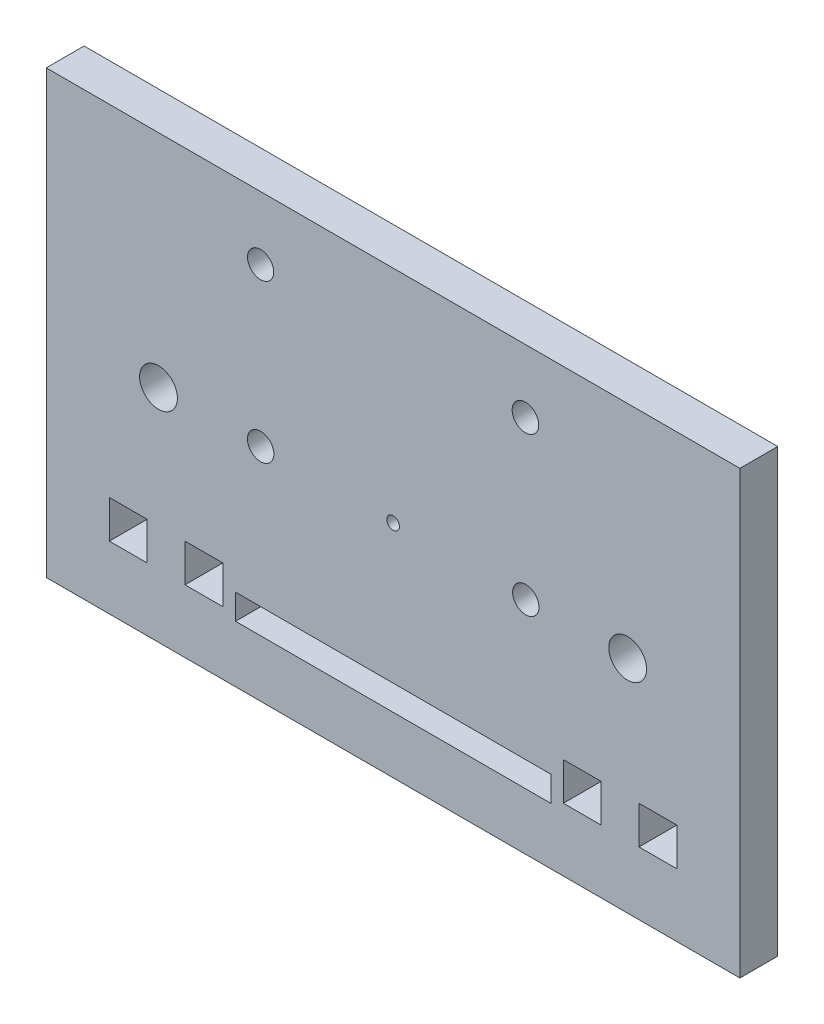
ISO-10303-21;
HEADER;
FILE_DESCRIPTION(('STEP AP214'),'2;1');
FILE_NAME('part.step','',(''),(''),'','','');
FILE_SCHEMA(('AUTOMOTIVE_DESIGN { 1 0 10303 214 1 1 1 1 }'));
ENDSEC;
DATA;
#1=APPLICATION_CONTEXT('core data for automotive mechanical design processes');
#2=APPLICATION_PROTOCOL_DEFINITION('international standard','automotive_design',2000,#1);
#3=PRODUCT_CONTEXT('',#1,'mechanical');
#4=PRODUCT('Part','Part','',(#3));
#5=PRODUCT_RELATED_PRODUCT_CATEGORY('part','',(#4));
#6=PRODUCT_DEFINITION_FORMATION('','',#4);
#7=PRODUCT_DEFINITION_CONTEXT('part definition',#1,'design');
#8=PRODUCT_DEFINITION('design','',#6,#7);
#9=PRODUCT_DEFINITION_SHAPE('','',#8);
#10=(LENGTH_UNIT() NAMED_UNIT(*) SI_UNIT(.MILLI.,.METRE.));
#11=(NAMED_UNIT(*) PLANE_ANGLE_UNIT() SI_UNIT($,.RADIAN.));
#12=(NAMED_UNIT(*) SI_UNIT($,.STERADIAN.) SOLID_ANGLE_UNIT());
#13=UNCERTAINTY_MEASURE_WITH_UNIT(LENGTH_MEASURE(1.E-05),#10,'distance_accuracy_value','');
#14=(GEOMETRIC_REPRESENTATION_CONTEXT(3) GLOBAL_UNCERTAINTY_ASSIGNED_CONTEXT((#13)) GLOBAL_UNIT_ASSIGNED_CONTEXT((#10,
#11,#12)) REPRESENTATION_CONTEXT('',''));
#15=CARTESIAN_POINT('',(0.,0.,0.));
#16=DIRECTION('',(0.,0.,1.));
#17=DIRECTION('',(1.,0.,0.));
#18=AXIS2_PLACEMENT_3D('',#15,#16,#17);
#19=CARTESIAN_POINT('',(0.,0.,3.));
#20=DIRECTION('',(0.,0.,-1.));
#21=DIRECTION('',(-1.,0.,0.));
#22=AXIS2_PLACEMENT_3D('',#19,#20,#21);
#23=PLANE('',#22);
#24=CARTESIAN_POINT('',(-10.5042104524228,12.4859981779281,3.));
#25=DIRECTION('',(0.,0.,1.));
#26=DIRECTION('',(1.,0.,0.));
#27=AXIS2_PLACEMENT_3D('',#24,#25,#26);
#28=CIRCLE('',#27,1.03797105295401);
#29=CARTESIAN_POINT('',(-9.46623939946874,12.4859981779281,3.));
#30=VERTEX_POINT('',#29);
#31=EDGE_CURVE('E795',#30,#30,#28,.T.);
#32=ORIENTED_EDGE('',*,*,#31,.F.);
#33=EDGE_LOOP('',(#32));
#34=FACE_BOUND('',#33,.T.);
#35=CARTESIAN_POINT('',(10.4942170004527,12.4883752274117,3.));
#36=DIRECTION('',(0.,0.,1.));
#37=DIRECTION('',(1.,0.,0.));
#38=AXIS2_PLACEMENT_3D('',#35,#36,#37);
#39=CIRCLE('',#38,1.0524891929786);
#40=CARTESIAN_POINT('',(11.5467061934313,12.4883752274117,3.));
#41=VERTEX_POINT('',#40);
#42=EDGE_CURVE('E800',#41,#41,#39,.T.);
#43=ORIENTED_EDGE('',*,*,#42,.F.);
#44=EDGE_LOOP('',(#43));
#45=FACE_BOUND('',#44,.T.);
#46=CARTESIAN_POINT('',(-10.5023216477709,-0.00263104180474381,3.));
#47=DIRECTION('',(0.,0.,1.));
#48=DIRECTION('',(1.,0.,0.));
#49=AXIS2_PLACEMENT_3D('',#46,#47,#48);
#50=CIRCLE('',#49,1.04781735771425);
#51=CARTESIAN_POINT('',(-9.45450429005665,-0.00263104180474381,3.));
#52=VERTEX_POINT('',#51);
#53=EDGE_CURVE('E807',#52,#52,#50,.T.);
#54=ORIENTED_EDGE('',*,*,#53,.F.);
#55=EDGE_LOOP('',(#54));
#56=FACE_BOUND('',#55,.T.);
#57=CARTESIAN_POINT('',(10.5239846187159,-0.00929074852966256,3.));
#58=DIRECTION('',(0.,0.,1.));
#59=DIRECTION('',(1.,0.,0.));
#60=AXIS2_PLACEMENT_3D('',#57,#58,#59);
#61=CIRCLE('',#60,1.04480594836211);
#62=CARTESIAN_POINT('',(11.568790567078,-0.00929074852966256,3.));
#63=VERTEX_POINT('',#62);
#64=EDGE_CURVE('E220',#63,#63,#61,.T.);
#65=ORIENTED_EDGE('',*,*,#64,.F.);
#66=EDGE_LOOP('',(#65));
#67=FACE_BOUND('',#66,.T.);
#68=DIRECTION('',(0.,-1.,0.));
#69=VECTOR('',#68,1.);
#70=CARTESIAN_POINT('',(-13.5,0.,3.));
#71=LINE('',#70,#69);
#72=CARTESIAN_POINT('',(-13.5,-9.5,3.));
#73=VERTEX_POINT('',#72);
#74=CARTESIAN_POINT('',(-13.5,-12.5,3.));
#75=VERTEX_POINT('',#74);
#76=EDGE_CURVE('E56',#73,#75,#71,.T.);
#77=ORIENTED_EDGE('',*,*,#76,.T.);
#78=DIRECTION('',(1.,0.,0.));
#79=VECTOR('',#78,1.);
#80=CARTESIAN_POINT('',(0.,-12.5,3.));
#81=LINE('',#80,#79);
#82=CARTESIAN_POINT('',(-16.5,-12.5,3.));
#83=VERTEX_POINT('',#82);
#84=EDGE_CURVE('E240',#83,#75,#81,.T.);
#85=ORIENTED_EDGE('',*,*,#84,.F.);
#86=DIRECTION('',(0.,-1.,0.));
#87=VECTOR('',#86,1.);
#88=CARTESIAN_POINT('',(-16.5,0.,3.));
#89=LINE('',#88,#87);
#90=CARTESIAN_POINT('',(-16.5,-9.5,3.));
#91=VERTEX_POINT('',#90);
#92=EDGE_CURVE('E254',#91,#83,#89,.T.);
#93=ORIENTED_EDGE('',*,*,#92,.F.);
#94=DIRECTION('',(1.,0.,0.));
#95=VECTOR('',#94,1.);
#96=CARTESIAN_POINT('',(0.,-9.5,3.));
#97=LINE('',#96,#95);
#98=EDGE_CURVE('E250',#91,#73,#97,.T.);
#99=ORIENTED_EDGE('',*,*,#98,.T.);
#100=EDGE_LOOP('',(#77,#85,#93,#99));
#101=FACE_BOUND('',#100,.T.);
#102=DIRECTION('',(0.,-1.,0.));
#103=VECTOR('',#102,1.);
#104=CARTESIAN_POINT('',(22.4999999999998,3.64291929955126E-13,3.));
#105=LINE('',#104,#103);
#106=CARTESIAN_POINT('',(22.4999999999999,-9.49999999999963,3.));
#107=VERTEX_POINT('',#106);
#108=CARTESIAN_POINT('',(22.5,-12.4999999999996,3.));
#109=VERTEX_POINT('',#108);
#110=EDGE_CURVE('E309',#107,#109,#105,.T.);
#111=ORIENTED_EDGE('',*,*,#110,.T.);
#112=DIRECTION('',(-1.,0.,0.));
#113=VECTOR('',#112,1.);
#114=CARTESIAN_POINT('',(2.02384405530628E-13,-12.5,3.));
#115=LINE('',#114,#113);
#116=CARTESIAN_POINT('',(19.5,-12.4999999999997,3.));
#117=VERTEX_POINT('',#116);
#118=EDGE_CURVE('E300',#109,#117,#115,.T.);
#119=ORIENTED_EDGE('',*,*,#118,.T.);
#120=DIRECTION('',(0.,-1.,0.));
#121=VECTOR('',#120,1.);
#122=CARTESIAN_POINT('',(19.4999999999998,3.15719672627776E-13,3.));
#123=LINE('',#122,#121);
#124=CARTESIAN_POINT('',(19.4999999999999,-9.49999999999968,3.));
#125=VERTEX_POINT('',#124);
#126=EDGE_CURVE('E316',#125,#117,#123,.T.);
#127=ORIENTED_EDGE('',*,*,#126,.F.);
#128=DIRECTION('',(-1.,0.,0.));
#129=VECTOR('',#128,1.);
#130=CARTESIAN_POINT('',(1.48318857196017E-13,-9.49999999999998,3.));
#131=LINE('',#130,#129);
#132=EDGE_CURVE('E312',#107,#125,#131,.T.);
#133=ORIENTED_EDGE('',*,*,#132,.F.);
#134=EDGE_LOOP('',(#111,#119,#127,#133));
#135=FACE_BOUND('',#134,.T.);
#136=DIRECTION('',(1.,0.,0.));
#137=VECTOR('',#136,1.);
#138=CARTESIAN_POINT('',(-12.4915760724029,-13.,3.));
#139=LINE('',#138,#137);
#140=CARTESIAN_POINT('',(-12.4915760724029,-13.,3.));
#141=VERTEX_POINT('',#140);
#142=CARTESIAN_POINT('',(12.5084239275971,-13.,3.));
#143=VERTEX_POINT('',#142);
#144=EDGE_CURVE('E330',#141,#143,#139,.T.);
#145=ORIENTED_EDGE('',*,*,#144,.F.);
#146=DIRECTION('',(0.,-1.,0.));
#147=VECTOR('',#146,1.);
#148=CARTESIAN_POINT('',(-12.4915760724029,-11.,3.));
#149=LINE('',#148,#147);
#150=CARTESIAN_POINT('',(-12.4915760724029,-11.,3.));
#151=VERTEX_POINT('',#150);
#152=EDGE_CURVE('E233',#151,#141,#149,.T.);
#153=ORIENTED_EDGE('',*,*,#152,.F.);
#154=DIRECTION('',(-1.,0.,0.));
#155=VECTOR('',#154,1.);
#156=CARTESIAN_POINT('',(-12.4915760724029,-11.,3.));
#157=LINE('',#156,#155);
#158=CARTESIAN_POINT('',(12.5084239275971,-11.,3.));
#159=VERTEX_POINT('',#158);
#160=EDGE_CURVE('E336',#159,#151,#157,.T.);
#161=ORIENTED_EDGE('',*,*,#160,.F.);
#162=DIRECTION('',(0.,1.,0.));
#163=VECTOR('',#162,1.);
#164=CARTESIAN_POINT('',(12.5084239275971,-11.,3.));
#165=LINE('',#164,#163);
#166=EDGE_CURVE('E333',#143,#159,#165,.T.);
#167=ORIENTED_EDGE('',*,*,#166,.F.);
#168=EDGE_LOOP('',(#145,#153,#161,#167));
#169=FACE_BOUND('',#168,.T.);
#170=DIRECTION('',(0.,1.,0.));
#171=VECTOR('',#170,1.);
#172=CARTESIAN_POINT('',(27.5,-17.5,3.));
#173=LINE('',#172,#171);
#174=CARTESIAN_POINT('',(27.5,-17.5,3.));
#175=VERTEX_POINT('',#174);
#176=CARTESIAN_POINT('',(27.5,17.5,3.));
#177=VERTEX_POINT('',#176);
#178=EDGE_CURVE('E367',#175,#177,#173,.T.);
#179=ORIENTED_EDGE('',*,*,#178,.T.);
#180=DIRECTION('',(-1.,0.,0.));
#181=VECTOR('',#180,1.);
#182=CARTESIAN_POINT('',(-27.5,17.5,3.));
#183=LINE('',#182,#181);
#184=CARTESIAN_POINT('',(-27.5,17.5,3.));
#185=VERTEX_POINT('',#184);
#186=EDGE_CURVE('E370',#177,#185,#183,.T.);
#187=ORIENTED_EDGE('',*,*,#186,.T.);
#188=DIRECTION('',(0.,-1.,0.));
#189=VECTOR('',#188,1.);
#190=CARTESIAN_POINT('',(-27.5,-17.5,3.));
#191=LINE('',#190,#189);
#192=CARTESIAN_POINT('',(-27.5,-17.5,3.));
#193=VERTEX_POINT('',#192);
#194=EDGE_CURVE('E373',#185,#193,#191,.T.);
#195=ORIENTED_EDGE('',*,*,#194,.T.);
#196=DIRECTION('',(1.,0.,0.));
#197=VECTOR('',#196,1.);
#198=CARTESIAN_POINT('',(-27.5,-17.5,3.));
#199=LINE('',#198,#197);
#200=EDGE_CURVE('E375',#193,#175,#199,.T.);
#201=ORIENTED_EDGE('',*,*,#200,.T.);
#202=EDGE_LOOP('',(#179,#187,#195,#201));
#203=FACE_BOUND('',#202,.T.);
#204=CARTESIAN_POINT('',(0.,0.,3.));
#205=DIRECTION('',(0.,0.,1.));
#206=DIRECTION('',(1.,0.,0.));
#207=AXIS2_PLACEMENT_3D('',#204,#205,#206);
#208=CIRCLE('',#207,0.5);
#209=CARTESIAN_POINT('',(0.499999999999993,0.,3.));
#210=VERTEX_POINT('',#209);
#211=EDGE_CURVE('E361',#210,#210,#208,.T.);
#212=ORIENTED_EDGE('',*,*,#211,.F.);
#213=EDGE_LOOP('',(#212));
#214=FACE_BOUND('',#213,.T.);
#215=CARTESIAN_POINT('',(18.6,1.02917697334902E-13,3.));
#216=DIRECTION('',(0.,0.,1.));
#217=DIRECTION('',(1.,0.,0.));
#218=AXIS2_PLACEMENT_3D('',#215,#216,#217);
#219=CIRCLE('',#218,1.5);
#220=CARTESIAN_POINT('',(20.1,1.02917697334902E-13,3.));
#221=VERTEX_POINT('',#220);
#222=EDGE_CURVE('E355',#221,#221,#219,.T.);
#223=ORIENTED_EDGE('',*,*,#222,.F.);
#224=EDGE_LOOP('',(#223));
#225=FACE_BOUND('',#224,.T.);
#226=CARTESIAN_POINT('',(-18.6,1.02917697334902E-13,3.));
#227=DIRECTION('',(0.,0.,1.));
#228=DIRECTION('',(-1.,0.,0.));
#229=AXIS2_PLACEMENT_3D('',#226,#227,#228);
#230=CIRCLE('',#229,1.5);
#231=CARTESIAN_POINT('',(-20.1,1.02917697334902E-13,3.));
#232=VERTEX_POINT('',#231);
#233=EDGE_CURVE('E349',#232,#232,#230,.T.);
#234=ORIENTED_EDGE('',*,*,#233,.F.);
#235=EDGE_LOOP('',(#234));
#236=FACE_BOUND('',#235,.T.);
#237=DIRECTION('',(0.,-1.,0.));
#238=VECTOR('',#237,1.);
#239=CARTESIAN_POINT('',(16.4999999999998,2.09901540593192E-13,3.));
#240=LINE('',#239,#238);
#241=CARTESIAN_POINT('',(16.5,-9.49999999999973,3.));
#242=VERTEX_POINT('',#241);
#243=CARTESIAN_POINT('',(16.5,-12.4999999999997,3.));
#244=VERTEX_POINT('',#243);
#245=EDGE_CURVE('E277',#242,#244,#240,.T.);
#246=ORIENTED_EDGE('',*,*,#245,.T.);
#247=DIRECTION('',(-1.,0.,0.));
#248=VECTOR('',#247,1.);
#249=CARTESIAN_POINT('',(2.09612420013865E-13,-12.5,3.));
#250=LINE('',#249,#248);
#251=CARTESIAN_POINT('',(13.5,-12.4999999999998,3.));
#252=VERTEX_POINT('',#251);
#253=EDGE_CURVE('E268',#244,#252,#250,.T.);
#254=ORIENTED_EDGE('',*,*,#253,.T.);
#255=DIRECTION('',(0.,-1.,0.));
#256=VECTOR('',#255,1.);
#257=CARTESIAN_POINT('',(13.4999999999998,2.02962646689284E-13,3.));
#258=LINE('',#257,#256);
#259=CARTESIAN_POINT('',(13.4999999999999,-9.49999999999978,3.));
#260=VERTEX_POINT('',#259);
#261=EDGE_CURVE('E284',#260,#252,#258,.T.);
#262=ORIENTED_EDGE('',*,*,#261,.F.);
#263=DIRECTION('',(-1.,0.,0.));
#264=VECTOR('',#263,1.);
#265=CARTESIAN_POINT('',(1.53812148203277E-13,-9.5,3.));
#266=LINE('',#265,#264);
#267=EDGE_CURVE('E280',#242,#260,#266,.T.);
#268=ORIENTED_EDGE('',*,*,#267,.F.);
#269=EDGE_LOOP('',(#246,#254,#262,#268));
#270=FACE_BOUND('',#269,.T.);
#271=DIRECTION('',(0.,-1.,0.));
#272=VECTOR('',#271,1.);
#273=CARTESIAN_POINT('',(-19.5,0.,3.));
#274=LINE('',#273,#272);
#275=CARTESIAN_POINT('',(-19.5,-9.5,3.));
#276=VERTEX_POINT('',#275);
#277=CARTESIAN_POINT('',(-19.5,-12.5,3.));
#278=VERTEX_POINT('',#277);
#279=EDGE_CURVE('E48',#276,#278,#274,.T.);
#280=ORIENTED_EDGE('',*,*,#279,.T.);
#281=DIRECTION('',(1.,0.,0.));
#282=VECTOR('',#281,1.);
#283=CARTESIAN_POINT('',(0.,-12.5,3.));
#284=LINE('',#283,#282);
#285=CARTESIAN_POINT('',(-22.5,-12.5,3.));
#286=VERTEX_POINT('',#285);
#287=EDGE_CURVE('E214',#286,#278,#284,.T.);
#288=ORIENTED_EDGE('',*,*,#287,.F.);
#289=DIRECTION('',(0.,1.,0.));
#290=VECTOR('',#289,1.);
#291=CARTESIAN_POINT('',(-22.5,0.,3.));
#292=LINE('',#291,#290);
#293=CARTESIAN_POINT('',(-22.5,-9.5,3.));
#294=VERTEX_POINT('',#293);
#295=EDGE_CURVE('E217',#286,#294,#292,.T.);
#296=ORIENTED_EDGE('',*,*,#295,.T.);
#297=DIRECTION('',(1.,0.,0.));
#298=VECTOR('',#297,1.);
#299=CARTESIAN_POINT('',(0.,-9.49999999999999,3.));
#300=LINE('',#299,#298);
#301=EDGE_CURVE('E226',#294,#276,#300,.T.);
#302=ORIENTED_EDGE('',*,*,#301,.T.);
#303=EDGE_LOOP('',(#280,#288,#296,#302));
#304=FACE_BOUND('',#303,.T.);
#305=ADVANCED_FACE('F33',(#34,#45,#56,#67,#101,#135,#169,#203,#214,#225,#236,#270,#304),#23,.F.);
#306=CARTESIAN_POINT('',(0.,0.,0.));
#307=DIRECTION('',(0.,0.,-1.));
#308=DIRECTION('',(-1.,0.,0.));
#309=AXIS2_PLACEMENT_3D('',#306,#307,#308);
#310=PLANE('',#309);
#311=CARTESIAN_POINT('',(-10.5042104524228,12.4859981779281,0.));
#312=DIRECTION('',(0.,0.,1.));
#313=DIRECTION('',(1.,0.,0.));
#314=AXIS2_PLACEMENT_3D('',#311,#312,#313);
#315=CIRCLE('',#314,1.03797105295401);
#316=CARTESIAN_POINT('',(-9.46623939946874,12.4859981779281,0.));
#317=VERTEX_POINT('',#316);
#318=EDGE_CURVE('E792',#317,#317,#315,.T.);
#319=ORIENTED_EDGE('',*,*,#318,.T.);
#320=EDGE_LOOP('',(#319));
#321=FACE_BOUND('',#320,.T.);
#322=CARTESIAN_POINT('',(10.4942170004527,12.4883752274117,0.));
#323=DIRECTION('',(0.,0.,1.));
#324=DIRECTION('',(1.,0.,0.));
#325=AXIS2_PLACEMENT_3D('',#322,#323,#324);
#326=CIRCLE('',#325,1.0524891929786);
#327=CARTESIAN_POINT('',(11.5467061934313,12.4883752274117,0.));
#328=VERTEX_POINT('',#327);
#329=EDGE_CURVE('E796',#328,#328,#326,.T.);
#330=ORIENTED_EDGE('',*,*,#329,.T.);
#331=EDGE_LOOP('',(#330));
#332=FACE_BOUND('',#331,.T.);
#333=CARTESIAN_POINT('',(-10.5023216477709,-0.00263104180474381,0.));
#334=DIRECTION('',(0.,0.,1.));
#335=DIRECTION('',(1.,0.,0.));
#336=AXIS2_PLACEMENT_3D('',#333,#334,#335);
#337=CIRCLE('',#336,1.04781735771425);
#338=CARTESIAN_POINT('',(-9.45450429005665,-0.00263104180474381,0.));
#339=VERTEX_POINT('',#338);
#340=EDGE_CURVE('E313',#339,#339,#337,.T.);
#341=ORIENTED_EDGE('',*,*,#340,.T.);
#342=EDGE_LOOP('',(#341));
#343=FACE_BOUND('',#342,.T.);
#344=CARTESIAN_POINT('',(10.5239846187159,-0.00929074852966256,0.));
#345=DIRECTION('',(0.,0.,1.));
#346=DIRECTION('',(1.,0.,0.));
#347=AXIS2_PLACEMENT_3D('',#344,#345,#346);
#348=CIRCLE('',#347,1.04480594836211);
#349=CARTESIAN_POINT('',(11.568790567078,-0.00929074852966256,0.));
#350=VERTEX_POINT('',#349);
#351=EDGE_CURVE('E809',#350,#350,#348,.T.);
#352=ORIENTED_EDGE('',*,*,#351,.T.);
#353=EDGE_LOOP('',(#352));
#354=FACE_BOUND('',#353,.T.);
#355=DIRECTION('',(0.,1.,0.));
#356=VECTOR('',#355,1.);
#357=CARTESIAN_POINT('',(-12.4915760724029,0.,0.));
#358=LINE('',#357,#356);
#359=CARTESIAN_POINT('',(-12.4915760724029,-13.,0.));
#360=VERTEX_POINT('',#359);
#361=CARTESIAN_POINT('',(-12.4915760724029,-11.,0.));
#362=VERTEX_POINT('',#361);
#363=EDGE_CURVE('E11',#360,#362,#358,.T.);
#364=ORIENTED_EDGE('',*,*,#363,.F.);
#365=DIRECTION('',(-1.,0.,0.));
#366=VECTOR('',#365,1.);
#367=CARTESIAN_POINT('',(0.,-13.,0.));
#368=LINE('',#367,#366);
#369=CARTESIAN_POINT('',(12.5084239275971,-13.,0.));
#370=VERTEX_POINT('',#369);
#371=EDGE_CURVE('E396',#370,#360,#368,.T.);
#372=ORIENTED_EDGE('',*,*,#371,.F.);
#373=DIRECTION('',(0.,-1.,0.));
#374=VECTOR('',#373,1.);
#375=CARTESIAN_POINT('',(12.5084239275971,0.,0.));
#376=LINE('',#375,#374);
#377=CARTESIAN_POINT('',(12.5084239275971,-11.,0.));
#378=VERTEX_POINT('',#377);
#379=EDGE_CURVE('E398',#378,#370,#376,.T.);
#380=ORIENTED_EDGE('',*,*,#379,.F.);
#381=DIRECTION('',(1.,0.,0.));
#382=VECTOR('',#381,1.);
#383=CARTESIAN_POINT('',(0.,-11.,0.));
#384=LINE('',#383,#382);
#385=EDGE_CURVE('E41',#362,#378,#384,.T.);
#386=ORIENTED_EDGE('',*,*,#385,.F.);
#387=EDGE_LOOP('',(#364,#372,#380,#386));
#388=FACE_BOUND('',#387,.T.);
#389=CARTESIAN_POINT('',(18.6,1.02917697334902E-13,0.));
#390=DIRECTION('',(0.,0.,1.));
#391=DIRECTION('',(1.,0.,0.));
#392=AXIS2_PLACEMENT_3D('',#389,#390,#391);
#393=CIRCLE('',#392,1.5);
#394=CARTESIAN_POINT('',(20.1,1.02917697334902E-13,0.));
#395=VERTEX_POINT('',#394);
#396=EDGE_CURVE('E352',#395,#395,#393,.T.);
#397=ORIENTED_EDGE('',*,*,#396,.T.);
#398=EDGE_LOOP('',(#397));
#399=FACE_BOUND('',#398,.T.);
#400=DIRECTION('',(0.,1.,0.));
#401=VECTOR('',#400,1.);
#402=CARTESIAN_POINT('',(27.5,-17.5,0.));
#403=LINE('',#402,#401);
#404=CARTESIAN_POINT('',(27.5,-17.5,0.));
#405=VERTEX_POINT('',#404);
#406=CARTESIAN_POINT('',(27.5,17.5,0.));
#407=VERTEX_POINT('',#406);
#408=EDGE_CURVE('E364',#405,#407,#403,.T.);
#409=ORIENTED_EDGE('',*,*,#408,.F.);
#410=DIRECTION('',(1.,0.,0.));
#411=VECTOR('',#410,1.);
#412=CARTESIAN_POINT('',(-27.5,-17.5,0.));
#413=LINE('',#412,#411);
#414=CARTESIAN_POINT('',(-27.5,-17.5,0.));
#415=VERTEX_POINT('',#414);
#416=EDGE_CURVE('E371',#415,#405,#413,.T.);
#417=ORIENTED_EDGE('',*,*,#416,.F.);
#418=DIRECTION('',(0.,-1.,0.));
#419=VECTOR('',#418,1.);
#420=CARTESIAN_POINT('',(-27.5,-17.5,0.));
#421=LINE('',#420,#419);
#422=CARTESIAN_POINT('',(-27.5,17.5,0.));
#423=VERTEX_POINT('',#422);
#424=EDGE_CURVE('E382',#423,#415,#421,.T.);
#425=ORIENTED_EDGE('',*,*,#424,.F.);
#426=DIRECTION('',(-1.,0.,0.));
#427=VECTOR('',#426,1.);
#428=CARTESIAN_POINT('',(-27.5,17.5,0.));
#429=LINE('',#428,#427);
#430=EDGE_CURVE('E380',#407,#423,#429,.T.);
#431=ORIENTED_EDGE('',*,*,#430,.F.);
#432=EDGE_LOOP('',(#409,#417,#425,#431));
#433=FACE_BOUND('',#432,.T.);
#434=CARTESIAN_POINT('',(0.,0.,0.));
#435=DIRECTION('',(0.,0.,1.));
#436=DIRECTION('',(1.,0.,0.));
#437=AXIS2_PLACEMENT_3D('',#434,#435,#436);
#438=CIRCLE('',#437,0.5);
#439=CARTESIAN_POINT('',(0.499999999999993,0.,0.));
#440=VERTEX_POINT('',#439);
#441=EDGE_CURVE('E358',#440,#440,#438,.T.);
#442=ORIENTED_EDGE('',*,*,#441,.T.);
#443=EDGE_LOOP('',(#442));
#444=FACE_BOUND('',#443,.T.);
#445=CARTESIAN_POINT('',(-18.6,1.02917697334902E-13,0.));
#446=DIRECTION('',(0.,0.,1.));
#447=DIRECTION('',(-1.,0.,0.));
#448=AXIS2_PLACEMENT_3D('',#445,#446,#447);
#449=CIRCLE('',#448,1.5);
#450=CARTESIAN_POINT('',(-20.1,1.02917697334902E-13,0.));
#451=VERTEX_POINT('',#450);
#452=EDGE_CURVE('E342',#451,#451,#449,.T.);
#453=ORIENTED_EDGE('',*,*,#452,.T.);
#454=EDGE_LOOP('',(#453));
#455=FACE_BOUND('',#454,.T.);
#456=DIRECTION('',(-1.,0.,0.));
#457=VECTOR('',#456,1.);
#458=CARTESIAN_POINT('',(2.02384405530628E-13,-12.5,0.));
#459=LINE('',#458,#457);
#460=CARTESIAN_POINT('',(22.5,-12.4999999999996,0.));
#461=VERTEX_POINT('',#460);
#462=CARTESIAN_POINT('',(19.5,-12.4999999999997,0.));
#463=VERTEX_POINT('',#462);
#464=EDGE_CURVE('E306',#461,#463,#459,.T.);
#465=ORIENTED_EDGE('',*,*,#464,.F.);
#466=DIRECTION('',(0.,-1.,0.));
#467=VECTOR('',#466,1.);
#468=CARTESIAN_POINT('',(22.4999999999998,3.64291929955126E-13,0.));
#469=LINE('',#468,#467);
#470=CARTESIAN_POINT('',(22.4999999999999,-9.49999999999963,0.));
#471=VERTEX_POINT('',#470);
#472=EDGE_CURVE('E297',#471,#461,#469,.T.);
#473=ORIENTED_EDGE('',*,*,#472,.F.);
#474=DIRECTION('',(-1.,0.,0.));
#475=VECTOR('',#474,1.);
#476=CARTESIAN_POINT('',(1.48318857196017E-13,-9.49999999999998,0.));
#477=LINE('',#476,#475);
#478=CARTESIAN_POINT('',(19.4999999999999,-9.49999999999968,0.));
#479=VERTEX_POINT('',#478);
#480=EDGE_CURVE('E299',#471,#479,#477,.T.);
#481=ORIENTED_EDGE('',*,*,#480,.T.);
#482=DIRECTION('',(0.,-1.,0.));
#483=VECTOR('',#482,1.);
#484=CARTESIAN_POINT('',(19.4999999999998,3.15719672627776E-13,0.));
#485=LINE('',#484,#483);
#486=EDGE_CURVE('E303',#479,#463,#485,.T.);
#487=ORIENTED_EDGE('',*,*,#486,.T.);
#488=EDGE_LOOP('',(#465,#473,#481,#487));
#489=FACE_BOUND('',#488,.T.);
#490=DIRECTION('',(-1.,0.,0.));
#491=VECTOR('',#490,1.);
#492=CARTESIAN_POINT('',(2.09612420013865E-13,-12.5,0.));
#493=LINE('',#492,#491);
#494=CARTESIAN_POINT('',(16.5,-12.4999999999997,0.));
#495=VERTEX_POINT('',#494);
#496=CARTESIAN_POINT('',(13.5,-12.4999999999998,0.));
#497=VERTEX_POINT('',#496);
#498=EDGE_CURVE('E274',#495,#497,#493,.T.);
#499=ORIENTED_EDGE('',*,*,#498,.F.);
#500=DIRECTION('',(0.,-1.,0.));
#501=VECTOR('',#500,1.);
#502=CARTESIAN_POINT('',(16.4999999999998,2.09901540593192E-13,0.));
#503=LINE('',#502,#501);
#504=CARTESIAN_POINT('',(16.5,-9.49999999999973,0.));
#505=VERTEX_POINT('',#504);
#506=EDGE_CURVE('E265',#505,#495,#503,.T.);
#507=ORIENTED_EDGE('',*,*,#506,.F.);
#508=DIRECTION('',(-1.,0.,0.));
#509=VECTOR('',#508,1.);
#510=CARTESIAN_POINT('',(1.53812148203277E-13,-9.5,0.));
#511=LINE('',#510,#509);
#512=CARTESIAN_POINT('',(13.4999999999999,-9.49999999999978,0.));
#513=VERTEX_POINT('',#512);
#514=EDGE_CURVE('E267',#505,#513,#511,.T.);
#515=ORIENTED_EDGE('',*,*,#514,.T.);
#516=DIRECTION('',(0.,-1.,0.));
#517=VECTOR('',#516,1.);
#518=CARTESIAN_POINT('',(13.4999999999998,2.02962646689284E-13,0.));
#519=LINE('',#518,#517);
#520=EDGE_CURVE('E271',#513,#497,#519,.T.);
#521=ORIENTED_EDGE('',*,*,#520,.T.);
#522=EDGE_LOOP('',(#499,#507,#515,#521));
#523=FACE_BOUND('',#522,.T.);
#524=DIRECTION('',(1.,0.,0.));
#525=VECTOR('',#524,1.);
#526=CARTESIAN_POINT('',(0.,-12.5,0.));
#527=LINE('',#526,#525);
#528=CARTESIAN_POINT('',(-16.5,-12.5,0.));
#529=VERTEX_POINT('',#528);
#530=CARTESIAN_POINT('',(-13.5,-12.5,0.));
#531=VERTEX_POINT('',#530);
#532=EDGE_CURVE('E245',#529,#531,#527,.T.);
#533=ORIENTED_EDGE('',*,*,#532,.T.);
#534=DIRECTION('',(0.,-1.,0.));
#535=VECTOR('',#534,1.);
#536=CARTESIAN_POINT('',(-13.5,0.,0.));
#537=LINE('',#536,#535);
#538=CARTESIAN_POINT('',(-13.5,-9.5,0.));
#539=VERTEX_POINT('',#538);
#540=EDGE_CURVE('E237',#539,#531,#537,.T.);
#541=ORIENTED_EDGE('',*,*,#540,.F.);
#542=DIRECTION('',(1.,0.,0.));
#543=VECTOR('',#542,1.);
#544=CARTESIAN_POINT('',(0.,-9.5,0.));
#545=LINE('',#544,#543);
#546=CARTESIAN_POINT('',(-16.5,-9.5,0.));
#547=VERTEX_POINT('',#546);
#548=EDGE_CURVE('E239',#547,#539,#545,.T.);
#549=ORIENTED_EDGE('',*,*,#548,.F.);
#550=DIRECTION('',(0.,-1.,0.));
#551=VECTOR('',#550,1.);
#552=CARTESIAN_POINT('',(-16.5,0.,0.));
#553=LINE('',#552,#551);
#554=EDGE_CURVE('E242',#547,#529,#553,.T.);
#555=ORIENTED_EDGE('',*,*,#554,.T.);
#556=EDGE_LOOP('',(#533,#541,#549,#555));
#557=FACE_BOUND('',#556,.T.);
#558=DIRECTION('',(1.,0.,0.));
#559=VECTOR('',#558,1.);
#560=CARTESIAN_POINT('',(0.,-12.5,0.));
#561=LINE('',#560,#559);
#562=CARTESIAN_POINT('',(-22.5,-12.5,0.));
#563=VERTEX_POINT('',#562);
#564=CARTESIAN_POINT('',(-19.5,-12.5,0.));
#565=VERTEX_POINT('',#564);
#566=EDGE_CURVE('E209',#563,#565,#561,.T.);
#567=ORIENTED_EDGE('',*,*,#566,.T.);
#568=DIRECTION('',(0.,-1.,0.));
#569=VECTOR('',#568,1.);
#570=CARTESIAN_POINT('',(-19.5,0.,0.));
#571=LINE('',#570,#569);
#572=CARTESIAN_POINT('',(-19.5,-9.5,0.));
#573=VERTEX_POINT('',#572);
#574=EDGE_CURVE('E205',#573,#565,#571,.T.);
#575=ORIENTED_EDGE('',*,*,#574,.F.);
#576=DIRECTION('',(1.,0.,0.));
#577=VECTOR('',#576,1.);
#578=CARTESIAN_POINT('',(0.,-9.49999999999999,0.));
#579=LINE('',#578,#577);
#580=CARTESIAN_POINT('',(-22.5,-9.5,0.));
#581=VERTEX_POINT('',#580);
#582=EDGE_CURVE('E194',#581,#573,#579,.T.);
#583=ORIENTED_EDGE('',*,*,#582,.F.);
#584=DIRECTION('',(0.,1.,0.));
#585=VECTOR('',#584,1.);
#586=CARTESIAN_POINT('',(-22.5,0.,0.));
#587=LINE('',#586,#585);
#588=EDGE_CURVE('E204',#563,#581,#587,.T.);
#589=ORIENTED_EDGE('',*,*,#588,.F.);
#590=EDGE_LOOP('',(#567,#575,#583,#589));
#591=FACE_BOUND('',#590,.T.);
#592=ADVANCED_FACE('F212',(#321,#332,#343,#354,#388,#399,#433,#444,#455,#489,#523,#557,#591),
#310,.T.);
#593=CARTESIAN_POINT('',(27.5,-17.5,3.));
#594=DIRECTION('',(-1.,0.,0.));
#595=DIRECTION('',(0.,0.,1.));
#596=AXIS2_PLACEMENT_3D('',#593,#594,#595);
#597=PLANE('',#596);
#598=ORIENTED_EDGE('',*,*,#408,.T.);
#599=DIRECTION('',(0.,0.,-1.));
#600=VECTOR('',#599,1.);
#601=CARTESIAN_POINT('',(27.5,17.5,3.));
#602=LINE('',#601,#600);
#603=EDGE_CURVE('E393',#177,#407,#602,.T.);
#604=ORIENTED_EDGE('',*,*,#603,.F.);
#605=ORIENTED_EDGE('',*,*,#178,.F.);
#606=DIRECTION('',(0.,0.,-1.));
#607=VECTOR('',#606,1.);
#608=CARTESIAN_POINT('',(27.5,-17.5,3.));
#609=LINE('',#608,#607);
#610=EDGE_CURVE('E377',#175,#405,#609,.T.);
#611=ORIENTED_EDGE('',*,*,#610,.T.);
#612=EDGE_LOOP('',(#598,#604,#605,#611));
#613=FACE_BOUND('',#612,.T.);
#614=ADVANCED_FACE('F35',(#613),#597,.F.);
#615=CARTESIAN_POINT('',(-27.5,17.5,3.));
#616=DIRECTION('',(0.,-1.,0.));
#617=DIRECTION('',(1.,0.,0.));
#618=AXIS2_PLACEMENT_3D('',#615,#616,#617);
#619=PLANE('',#618);
#620=ORIENTED_EDGE('',*,*,#430,.T.);
#621=DIRECTION('',(0.,0.,-1.));
#622=VECTOR('',#621,1.);
#623=CARTESIAN_POINT('',(-27.5,17.5,3.));
#624=LINE('',#623,#622);
#625=EDGE_CURVE('E390',#185,#423,#624,.T.);
#626=ORIENTED_EDGE('',*,*,#625,.F.);
#627=ORIENTED_EDGE('',*,*,#186,.F.);
#628=ORIENTED_EDGE('',*,*,#603,.T.);
#629=EDGE_LOOP('',(#620,#626,#627,#628));
#630=FACE_BOUND('',#629,.T.);
#631=ADVANCED_FACE('F533',(#630),#619,.F.);
#632=CARTESIAN_POINT('',(-27.5,-17.5,3.));
#633=DIRECTION('',(1.,0.,0.));
#634=DIRECTION('',(0.,1.,0.));
#635=AXIS2_PLACEMENT_3D('',#632,#633,#634);
#636=PLANE('',#635);
#637=ORIENTED_EDGE('',*,*,#424,.T.);
#638=DIRECTION('',(0.,0.,-1.));
#639=VECTOR('',#638,1.);
#640=CARTESIAN_POINT('',(-27.5,-17.5,3.));
#641=LINE('',#640,#639);
#642=EDGE_CURVE('E387',#193,#415,#641,.T.);
#643=ORIENTED_EDGE('',*,*,#642,.F.);
#644=ORIENTED_EDGE('',*,*,#194,.F.);
#645=ORIENTED_EDGE('',*,*,#625,.T.);
#646=EDGE_LOOP('',(#637,#643,#644,#645));
#647=FACE_BOUND('',#646,.T.);
#648=ADVANCED_FACE('F530',(#647),#636,.F.);
#649=CARTESIAN_POINT('',(-27.5,-17.5,3.));
#650=DIRECTION('',(0.,1.,0.));
#651=DIRECTION('',(-1.,0.,0.));
#652=AXIS2_PLACEMENT_3D('',#649,#650,#651);
#653=PLANE('',#652);
#654=ORIENTED_EDGE('',*,*,#416,.T.);
#655=ORIENTED_EDGE('',*,*,#610,.F.);
#656=ORIENTED_EDGE('',*,*,#200,.F.);
#657=ORIENTED_EDGE('',*,*,#642,.T.);
#658=EDGE_LOOP('',(#654,#655,#656,#657));
#659=FACE_BOUND('',#658,.T.);
#660=ADVANCED_FACE('F522',(#659),#653,.F.);
#661=CARTESIAN_POINT('',(0.,0.,3.));
#662=DIRECTION('',(0.,0.,-1.));
#663=DIRECTION('',(-1.,0.,0.));
#664=AXIS2_PLACEMENT_3D('',#661,#662,#663);
#665=CYLINDRICAL_SURFACE('',#664,0.5);
#666=ORIENTED_EDGE('',*,*,#211,.T.);
#667=EDGE_LOOP('',(#666));
#668=FACE_BOUND('',#667,.T.);
#669=ORIENTED_EDGE('',*,*,#441,.F.);
#670=EDGE_LOOP('',(#669));
#671=FACE_BOUND('',#670,.T.);
#672=ADVANCED_FACE('F519',(#668,#671),#665,.F.);
#673=CARTESIAN_POINT('',(18.6,1.02917697334902E-13,3.));
#674=DIRECTION('',(0.,0.,-1.));
#675=DIRECTION('',(-1.,0.,0.));
#676=AXIS2_PLACEMENT_3D('',#673,#674,#675);
#677=CYLINDRICAL_SURFACE('',#676,1.5);
#678=ORIENTED_EDGE('',*,*,#222,.T.);
#679=EDGE_LOOP('',(#678));
#680=FACE_BOUND('',#679,.T.);
#681=ORIENTED_EDGE('',*,*,#396,.F.);
#682=EDGE_LOOP('',(#681));
#683=FACE_BOUND('',#682,.T.);
#684=ADVANCED_FACE('F515',(#680,#683),#677,.F.);
#685=CARTESIAN_POINT('',(-18.6,1.02917697334902E-13,3.));
#686=DIRECTION('',(0.,0.,-1.));
#687=DIRECTION('',(-1.,0.,0.));
#688=AXIS2_PLACEMENT_3D('',#685,#686,#687);
#689=CYLINDRICAL_SURFACE('',#688,1.5);
#690=ORIENTED_EDGE('',*,*,#233,.T.);
#691=EDGE_LOOP('',(#690));
#692=FACE_BOUND('',#691,.T.);
#693=ORIENTED_EDGE('',*,*,#452,.F.);
#694=EDGE_LOOP('',(#693));
#695=FACE_BOUND('',#694,.T.);
#696=ADVANCED_FACE('F512',(#692,#695),#689,.F.);
#697=CARTESIAN_POINT('',(-12.4915760724029,-11.,-1.));
#698=DIRECTION('',(-1.,0.,0.));
#699=DIRECTION('',(0.,0.,1.));
#700=AXIS2_PLACEMENT_3D('',#697,#698,#699);
#701=PLANE('',#700);
#702=ORIENTED_EDGE('',*,*,#363,.T.);
#703=DIRECTION('',(0.,0.,1.));
#704=VECTOR('',#703,1.);
#705=CARTESIAN_POINT('',(-12.4915760724029,-11.,-1.));
#706=LINE('',#705,#704);
#707=EDGE_CURVE('E340',#362,#151,#706,.T.);
#708=ORIENTED_EDGE('',*,*,#707,.T.);
#709=ORIENTED_EDGE('',*,*,#152,.T.);
#710=DIRECTION('',(0.,0.,1.));
#711=VECTOR('',#710,1.);
#712=CARTESIAN_POINT('',(-12.4915760724029,-13.,-1.));
#713=LINE('',#712,#711);
#714=EDGE_CURVE('E339',#360,#141,#713,.T.);
#715=ORIENTED_EDGE('',*,*,#714,.F.);
#716=EDGE_LOOP('',(#702,#708,#709,#715));
#717=FACE_BOUND('',#716,.T.);
#718=ADVANCED_FACE('F419',(#717),#701,.F.);
#719=CARTESIAN_POINT('',(-12.4915760724029,-11.,-1.));
#720=DIRECTION('',(0.,1.,0.));
#721=DIRECTION('',(0.,0.,1.));
#722=AXIS2_PLACEMENT_3D('',#719,#720,#721);
#723=PLANE('',#722);
#724=ORIENTED_EDGE('',*,*,#385,.T.);
#725=DIRECTION('',(0.,0.,1.));
#726=VECTOR('',#725,1.);
#727=CARTESIAN_POINT('',(12.5084239275971,-11.,-1.));
#728=LINE('',#727,#726);
#729=EDGE_CURVE('E343',#378,#159,#728,.T.);
#730=ORIENTED_EDGE('',*,*,#729,.T.);
#731=ORIENTED_EDGE('',*,*,#160,.T.);
#732=ORIENTED_EDGE('',*,*,#707,.F.);
#733=EDGE_LOOP('',(#724,#730,#731,#732));
#734=FACE_BOUND('',#733,.T.);
#735=ADVANCED_FACE('F404',(#734),#723,.F.);
#736=CARTESIAN_POINT('',(12.5084239275971,-11.,-1.));
#737=DIRECTION('',(1.,0.,0.));
#738=DIRECTION('',(0.,1.,0.));
#739=AXIS2_PLACEMENT_3D('',#736,#737,#738);
#740=PLANE('',#739);
#741=ORIENTED_EDGE('',*,*,#379,.T.);
#742=DIRECTION('',(0.,0.,1.));
#743=VECTOR('',#742,1.);
#744=CARTESIAN_POINT('',(12.5084239275971,-13.,-1.));
#745=LINE('',#744,#743);
#746=EDGE_CURVE('E345',#370,#143,#745,.T.);
#747=ORIENTED_EDGE('',*,*,#746,.T.);
#748=ORIENTED_EDGE('',*,*,#166,.T.);
#749=ORIENTED_EDGE('',*,*,#729,.F.);
#750=EDGE_LOOP('',(#741,#747,#748,#749));
#751=FACE_BOUND('',#750,.T.);
#752=ADVANCED_FACE('F409',(#751),#740,.F.);
#753=CARTESIAN_POINT('',(-12.4915760724029,-13.,-1.));
#754=DIRECTION('',(0.,-1.,0.));
#755=DIRECTION('',(1.,0.,0.));
#756=AXIS2_PLACEMENT_3D('',#753,#754,#755);
#757=PLANE('',#756);
#758=ORIENTED_EDGE('',*,*,#371,.T.);
#759=ORIENTED_EDGE('',*,*,#714,.T.);
#760=ORIENTED_EDGE('',*,*,#144,.T.);
#761=ORIENTED_EDGE('',*,*,#746,.F.);
#762=EDGE_LOOP('',(#758,#759,#760,#761));
#763=FACE_BOUND('',#762,.T.);
#764=ADVANCED_FACE('F416',(#763),#757,.F.);
#765=CARTESIAN_POINT('',(22.4999999999998,3.64291929955126E-13,0.));
#766=DIRECTION('',(-1.,0.,0.));
#767=DIRECTION('',(0.,-1.,0.));
#768=AXIS2_PLACEMENT_3D('',#765,#766,#767);
#769=PLANE('',#768);
#770=ORIENTED_EDGE('',*,*,#110,.F.);
#771=DIRECTION('',(0.,0.,1.));
#772=VECTOR('',#771,1.);
#773=CARTESIAN_POINT('',(22.4999999999999,-9.49999999999963,0.));
#774=LINE('',#773,#772);
#775=EDGE_CURVE('E308',#471,#107,#774,.T.);
#776=ORIENTED_EDGE('',*,*,#775,.F.);
#777=ORIENTED_EDGE('',*,*,#472,.T.);
#778=DIRECTION('',(0.,0.,1.));
#779=VECTOR('',#778,1.);
#780=CARTESIAN_POINT('',(22.5,-12.4999999999996,0.));
#781=LINE('',#780,#779);
#782=EDGE_CURVE('E281',#461,#109,#781,.T.);
#783=ORIENTED_EDGE('',*,*,#782,.T.);
#784=EDGE_LOOP('',(#770,#776,#777,#783));
#785=FACE_BOUND('',#784,.T.);
#786=ADVANCED_FACE('F493',(#785),#769,.T.);
#787=CARTESIAN_POINT('',(2.02384405530628E-13,-12.5,0.));
#788=DIRECTION('',(0.,1.,0.));
#789=DIRECTION('',(-1.,0.,0.));
#790=AXIS2_PLACEMENT_3D('',#787,#788,#789);
#791=PLANE('',#790);
#792=ORIENTED_EDGE('',*,*,#118,.F.);
#793=ORIENTED_EDGE('',*,*,#782,.F.);
#794=ORIENTED_EDGE('',*,*,#464,.T.);
#795=DIRECTION('',(0.,0.,1.));
#796=VECTOR('',#795,1.);
#797=CARTESIAN_POINT('',(19.5,-12.4999999999997,0.));
#798=LINE('',#797,#796);
#799=EDGE_CURVE('E323',#463,#117,#798,.T.);
#800=ORIENTED_EDGE('',*,*,#799,.T.);
#801=EDGE_LOOP('',(#792,#793,#794,#800));
#802=FACE_BOUND('',#801,.T.);
#803=ADVANCED_FACE('F489',(#802),#791,.T.);
#804=CARTESIAN_POINT('',(19.4999999999998,3.15719672627776E-13,0.));
#805=DIRECTION('',(-1.,0.,0.));
#806=DIRECTION('',(0.,-1.,0.));
#807=AXIS2_PLACEMENT_3D('',#804,#805,#806);
#808=PLANE('',#807);
#809=ORIENTED_EDGE('',*,*,#126,.T.);
#810=ORIENTED_EDGE('',*,*,#799,.F.);
#811=ORIENTED_EDGE('',*,*,#486,.F.);
#812=DIRECTION('',(0.,0.,1.));
#813=VECTOR('',#812,1.);
#814=CARTESIAN_POINT('',(19.4999999999999,-9.49999999999968,0.));
#815=LINE('',#814,#813);
#816=EDGE_CURVE('E325',#479,#125,#815,.T.);
#817=ORIENTED_EDGE('',*,*,#816,.T.);
#818=EDGE_LOOP('',(#809,#810,#811,#817));
#819=FACE_BOUND('',#818,.T.);
#820=ADVANCED_FACE('F492',(#819),#808,.F.);
#821=CARTESIAN_POINT('',(1.48318857196017E-13,-9.49999999999998,0.));
#822=DIRECTION('',(0.,1.,0.));
#823=DIRECTION('',(-1.,0.,0.));
#824=AXIS2_PLACEMENT_3D('',#821,#822,#823);
#825=PLANE('',#824);
#826=ORIENTED_EDGE('',*,*,#132,.T.);
#827=ORIENTED_EDGE('',*,*,#816,.F.);
#828=ORIENTED_EDGE('',*,*,#480,.F.);
#829=ORIENTED_EDGE('',*,*,#775,.T.);
#830=EDGE_LOOP('',(#826,#827,#828,#829));
#831=FACE_BOUND('',#830,.T.);
#832=ADVANCED_FACE('F487',(#831),#825,.F.);
#833=CARTESIAN_POINT('',(16.4999999999998,2.09901540593192E-13,0.));
#834=DIRECTION('',(-1.,0.,0.));
#835=DIRECTION('',(0.,-1.,0.));
#836=AXIS2_PLACEMENT_3D('',#833,#834,#835);
#837=PLANE('',#836);
#838=ORIENTED_EDGE('',*,*,#245,.F.);
#839=DIRECTION('',(0.,0.,1.));
#840=VECTOR('',#839,1.);
#841=CARTESIAN_POINT('',(16.5,-9.49999999999973,0.));
#842=LINE('',#841,#840);
#843=EDGE_CURVE('E276',#505,#242,#842,.T.);
#844=ORIENTED_EDGE('',*,*,#843,.F.);
#845=ORIENTED_EDGE('',*,*,#506,.T.);
#846=DIRECTION('',(0.,0.,1.));
#847=VECTOR('',#846,1.);
#848=CARTESIAN_POINT('',(16.5,-12.4999999999997,0.));
#849=LINE('',#848,#847);
#850=EDGE_CURVE('E251',#495,#244,#849,.T.);
#851=ORIENTED_EDGE('',*,*,#850,.T.);
#852=EDGE_LOOP('',(#838,#844,#845,#851));
#853=FACE_BOUND('',#852,.T.);
#854=ADVANCED_FACE('F477',(#853),#837,.T.);
#855=CARTESIAN_POINT('',(2.09612420013865E-13,-12.5,0.));
#856=DIRECTION('',(0.,1.,0.));
#857=DIRECTION('',(-1.,0.,0.));
#858=AXIS2_PLACEMENT_3D('',#855,#856,#857);
#859=PLANE('',#858);
#860=ORIENTED_EDGE('',*,*,#253,.F.);
#861=ORIENTED_EDGE('',*,*,#850,.F.);
#862=ORIENTED_EDGE('',*,*,#498,.T.);
#863=DIRECTION('',(0.,0.,1.));
#864=VECTOR('',#863,1.);
#865=CARTESIAN_POINT('',(13.5,-12.4999999999998,0.));
#866=LINE('',#865,#864);
#867=EDGE_CURVE('E291',#497,#252,#866,.T.);
#868=ORIENTED_EDGE('',*,*,#867,.T.);
#869=EDGE_LOOP('',(#860,#861,#862,#868));
#870=FACE_BOUND('',#869,.T.);
#871=ADVANCED_FACE('F473',(#870),#859,.T.);
#872=CARTESIAN_POINT('',(13.4999999999998,2.02962646689284E-13,0.));
#873=DIRECTION('',(-1.,0.,0.));
#874=DIRECTION('',(0.,-1.,0.));
#875=AXIS2_PLACEMENT_3D('',#872,#873,#874);
#876=PLANE('',#875);
#877=ORIENTED_EDGE('',*,*,#261,.T.);
#878=ORIENTED_EDGE('',*,*,#867,.F.);
#879=ORIENTED_EDGE('',*,*,#520,.F.);
#880=DIRECTION('',(0.,0.,1.));
#881=VECTOR('',#880,1.);
#882=CARTESIAN_POINT('',(13.4999999999999,-9.49999999999978,0.));
#883=LINE('',#882,#881);
#884=EDGE_CURVE('E293',#513,#260,#883,.T.);
#885=ORIENTED_EDGE('',*,*,#884,.T.);
#886=EDGE_LOOP('',(#877,#878,#879,#885));
#887=FACE_BOUND('',#886,.T.);
#888=ADVANCED_FACE('F476',(#887),#876,.F.);
#889=CARTESIAN_POINT('',(1.53812148203277E-13,-9.5,0.));
#890=DIRECTION('',(0.,1.,0.));
#891=DIRECTION('',(-1.,0.,0.));
#892=AXIS2_PLACEMENT_3D('',#889,#890,#891);
#893=PLANE('',#892);
#894=ORIENTED_EDGE('',*,*,#267,.T.);
#895=ORIENTED_EDGE('',*,*,#884,.F.);
#896=ORIENTED_EDGE('',*,*,#514,.F.);
#897=ORIENTED_EDGE('',*,*,#843,.T.);
#898=EDGE_LOOP('',(#894,#895,#896,#897));
#899=FACE_BOUND('',#898,.T.);
#900=ADVANCED_FACE('F472',(#899),#893,.F.);
#901=CARTESIAN_POINT('',(-13.5,0.,0.));
#902=DIRECTION('',(-1.,0.,0.));
#903=DIRECTION('',(0.,-1.,0.));
#904=AXIS2_PLACEMENT_3D('',#901,#902,#903);
#905=PLANE('',#904);
#906=ORIENTED_EDGE('',*,*,#76,.F.);
#907=DIRECTION('',(0.,0.,1.));
#908=VECTOR('',#907,1.);
#909=CARTESIAN_POINT('',(-13.5,-9.5,0.));
#910=LINE('',#909,#908);
#911=EDGE_CURVE('E248',#539,#73,#910,.T.);
#912=ORIENTED_EDGE('',*,*,#911,.F.);
#913=ORIENTED_EDGE('',*,*,#540,.T.);
#914=DIRECTION('',(0.,0.,1.));
#915=VECTOR('',#914,1.);
#916=CARTESIAN_POINT('',(-13.5,-12.5,0.));
#917=LINE('',#916,#915);
#918=EDGE_CURVE('E227',#531,#75,#917,.T.);
#919=ORIENTED_EDGE('',*,*,#918,.T.);
#920=EDGE_LOOP('',(#906,#912,#913,#919));
#921=FACE_BOUND('',#920,.T.);
#922=ADVANCED_FACE('F462',(#921),#905,.T.);
#923=CARTESIAN_POINT('',(0.,-12.5,0.));
#924=DIRECTION('',(0.,-1.,0.));
#925=DIRECTION('',(0.,0.,-1.));
#926=AXIS2_PLACEMENT_3D('',#923,#924,#925);
#927=PLANE('',#926);
#928=ORIENTED_EDGE('',*,*,#84,.T.);
#929=ORIENTED_EDGE('',*,*,#918,.F.);
#930=ORIENTED_EDGE('',*,*,#532,.F.);
#931=DIRECTION('',(0.,0.,1.));
#932=VECTOR('',#931,1.);
#933=CARTESIAN_POINT('',(-16.5,-12.5,0.));
#934=LINE('',#933,#932);
#935=EDGE_CURVE('E260',#529,#83,#934,.T.);
#936=ORIENTED_EDGE('',*,*,#935,.T.);
#937=EDGE_LOOP('',(#928,#929,#930,#936));
#938=FACE_BOUND('',#937,.T.);
#939=ADVANCED_FACE('F458',(#938),#927,.F.);
#940=CARTESIAN_POINT('',(-16.5,0.,0.));
#941=DIRECTION('',(-1.,0.,0.));
#942=DIRECTION('',(0.,-1.,0.));
#943=AXIS2_PLACEMENT_3D('',#940,#941,#942);
#944=PLANE('',#943);
#945=ORIENTED_EDGE('',*,*,#92,.T.);
#946=ORIENTED_EDGE('',*,*,#935,.F.);
#947=ORIENTED_EDGE('',*,*,#554,.F.);
#948=DIRECTION('',(0.,0.,1.));
#949=VECTOR('',#948,1.);
#950=CARTESIAN_POINT('',(-16.5,-9.5,0.));
#951=LINE('',#950,#949);
#952=EDGE_CURVE('E262',#547,#91,#951,.T.);
#953=ORIENTED_EDGE('',*,*,#952,.T.);
#954=EDGE_LOOP('',(#945,#946,#947,#953));
#955=FACE_BOUND('',#954,.T.);
#956=ADVANCED_FACE('F461',(#955),#944,.F.);
#957=CARTESIAN_POINT('',(0.,-9.5,0.));
#958=DIRECTION('',(0.,-1.,0.));
#959=DIRECTION('',(0.,0.,-1.));
#960=AXIS2_PLACEMENT_3D('',#957,#958,#959);
#961=PLANE('',#960);
#962=ORIENTED_EDGE('',*,*,#98,.F.);
#963=ORIENTED_EDGE('',*,*,#952,.F.);
#964=ORIENTED_EDGE('',*,*,#548,.T.);
#965=ORIENTED_EDGE('',*,*,#911,.T.);
#966=EDGE_LOOP('',(#962,#963,#964,#965));
#967=FACE_BOUND('',#966,.T.);
#968=ADVANCED_FACE('F450',(#967),#961,.T.);
#969=CARTESIAN_POINT('',(-19.5,0.,0.));
#970=DIRECTION('',(-1.,0.,0.));
#971=DIRECTION('',(0.,0.,1.));
#972=AXIS2_PLACEMENT_3D('',#969,#970,#971);
#973=PLANE('',#972);
#974=ORIENTED_EDGE('',*,*,#279,.F.);
#975=DIRECTION('',(0.,0.,1.));
#976=VECTOR('',#975,1.);
#977=CARTESIAN_POINT('',(-19.5,-9.5,0.));
#978=LINE('',#977,#976);
#979=EDGE_CURVE('E197',#573,#276,#978,.T.);
#980=ORIENTED_EDGE('',*,*,#979,.F.);
#981=ORIENTED_EDGE('',*,*,#574,.T.);
#982=DIRECTION('',(0.,0.,1.));
#983=VECTOR('',#982,1.);
#984=CARTESIAN_POINT('',(-19.5,-12.5,0.));
#985=LINE('',#984,#983);
#986=EDGE_CURVE('E231',#565,#278,#985,.T.);
#987=ORIENTED_EDGE('',*,*,#986,.T.);
#988=EDGE_LOOP('',(#974,#980,#981,#987));
#989=FACE_BOUND('',#988,.T.);
#990=ADVANCED_FACE('F207',(#989),#973,.T.);
#991=CARTESIAN_POINT('',(0.,-12.5,0.));
#992=DIRECTION('',(0.,-1.,0.));
#993=DIRECTION('',(0.,0.,-1.));
#994=AXIS2_PLACEMENT_3D('',#991,#992,#993);
#995=PLANE('',#994);
#996=ORIENTED_EDGE('',*,*,#287,.T.);
#997=ORIENTED_EDGE('',*,*,#986,.F.);
#998=ORIENTED_EDGE('',*,*,#566,.F.);
#999=DIRECTION('',(0.,0.,1.));
#1000=VECTOR('',#999,1.);
#1001=CARTESIAN_POINT('',(-22.5,-12.5,0.));
#1002=LINE('',#1001,#1000);
#1003=EDGE_CURVE('E234',#563,#286,#1002,.T.);
#1004=ORIENTED_EDGE('',*,*,#1003,.T.);
#1005=EDGE_LOOP('',(#996,#997,#998,#1004));
#1006=FACE_BOUND('',#1005,.T.);
#1007=ADVANCED_FACE('F442',(#1006),#995,.F.);
#1008=CARTESIAN_POINT('',(-22.5,0.,0.));
#1009=DIRECTION('',(1.,0.,0.));
#1010=DIRECTION('',(0.,0.,-1.));
#1011=AXIS2_PLACEMENT_3D('',#1008,#1009,#1010);
#1012=PLANE('',#1011);
#1013=ORIENTED_EDGE('',*,*,#295,.F.);
#1014=ORIENTED_EDGE('',*,*,#1003,.F.);
#1015=ORIENTED_EDGE('',*,*,#588,.T.);
#1016=DIRECTION('',(0.,0.,1.));
#1017=VECTOR('',#1016,1.);
#1018=CARTESIAN_POINT('',(-22.5,-9.5,0.));
#1019=LINE('',#1018,#1017);
#1020=EDGE_CURVE('E199',#581,#294,#1019,.T.);
#1021=ORIENTED_EDGE('',*,*,#1020,.T.);
#1022=EDGE_LOOP('',(#1013,#1014,#1015,#1021));
#1023=FACE_BOUND('',#1022,.T.);
#1024=ADVANCED_FACE('F440',(#1023),#1012,.T.);
#1025=CARTESIAN_POINT('',(0.,-9.49999999999999,0.));
#1026=DIRECTION('',(0.,-1.,0.));
#1027=DIRECTION('',(1.,0.,0.));
#1028=AXIS2_PLACEMENT_3D('',#1025,#1026,#1027);
#1029=PLANE('',#1028);
#1030=ORIENTED_EDGE('',*,*,#301,.F.);
#1031=ORIENTED_EDGE('',*,*,#1020,.F.);
#1032=ORIENTED_EDGE('',*,*,#582,.T.);
#1033=ORIENTED_EDGE('',*,*,#979,.T.);
#1034=EDGE_LOOP('',(#1030,#1031,#1032,#1033));
#1035=FACE_BOUND('',#1034,.T.);
#1036=ADVANCED_FACE('F196',(#1035),#1029,.T.);
#1037=CARTESIAN_POINT('',(10.5239846187159,-0.00929074852966256,0.));
#1038=DIRECTION('',(0.,0.,1.));
#1039=DIRECTION('',(1.,0.,0.));
#1040=AXIS2_PLACEMENT_3D('',#1037,#1038,#1039);
#1041=CYLINDRICAL_SURFACE('',#1040,1.04480594836211);
#1042=ORIENTED_EDGE('',*,*,#351,.F.);
#1043=EDGE_LOOP('',(#1042));
#1044=FACE_BOUND('',#1043,.T.);
#1045=ORIENTED_EDGE('',*,*,#64,.T.);
#1046=EDGE_LOOP('',(#1045));
#1047=FACE_BOUND('',#1046,.T.);
#1048=ADVANCED_FACE('F453',(#1044,#1047),#1041,.F.);
#1049=CARTESIAN_POINT('',(-10.5023216477709,-0.00263104180474381,0.));
#1050=DIRECTION('',(0.,0.,1.));
#1051=DIRECTION('',(1.,0.,0.));
#1052=AXIS2_PLACEMENT_3D('',#1049,#1050,#1051);
#1053=CYLINDRICAL_SURFACE('',#1052,1.04781735771425);
#1054=ORIENTED_EDGE('',*,*,#340,.F.);
#1055=EDGE_LOOP('',(#1054));
#1056=FACE_BOUND('',#1055,.T.);
#1057=ORIENTED_EDGE('',*,*,#53,.T.);
#1058=EDGE_LOOP('',(#1057));
#1059=FACE_BOUND('',#1058,.T.);
#1060=ADVANCED_FACE('F752',(#1056,#1059),#1053,.F.);
#1061=CARTESIAN_POINT('',(10.4942170004527,12.4883752274117,0.));
#1062=DIRECTION('',(0.,0.,1.));
#1063=DIRECTION('',(1.,0.,0.));
#1064=AXIS2_PLACEMENT_3D('',#1061,#1062,#1063);
#1065=CYLINDRICAL_SURFACE('',#1064,1.0524891929786);
#1066=ORIENTED_EDGE('',*,*,#329,.F.);
#1067=EDGE_LOOP('',(#1066));
#1068=FACE_BOUND('',#1067,.T.);
#1069=ORIENTED_EDGE('',*,*,#42,.T.);
#1070=EDGE_LOOP('',(#1069));
#1071=FACE_BOUND('',#1070,.T.);
#1072=ADVANCED_FACE('F760',(#1068,#1071),#1065,.F.);
#1073=CARTESIAN_POINT('',(-10.5042104524228,12.4859981779281,0.));
#1074=DIRECTION('',(0.,0.,1.));
#1075=DIRECTION('',(1.,0.,0.));
#1076=AXIS2_PLACEMENT_3D('',#1073,#1074,#1075);
#1077=CYLINDRICAL_SURFACE('',#1076,1.03797105295401);
#1078=ORIENTED_EDGE('',*,*,#318,.F.);
#1079=EDGE_LOOP('',(#1078));
#1080=FACE_BOUND('',#1079,.T.);
#1081=ORIENTED_EDGE('',*,*,#31,.T.);
#1082=EDGE_LOOP('',(#1081));
#1083=FACE_BOUND('',#1082,.T.);
#1084=ADVANCED_FACE('F775',(#1080,#1083),#1077,.F.);
#1085=CLOSED_SHELL('',(#305,#592,#614,#631,#648,#660,#672,#684,#696,#718,#735,#752,#764,#786,
#803,#820,#832,#854,#871,#888,#900,#922,#939,#956,#968,#990,#1007,#1024,#1036,#1048,#1060,#1072,#1084));
#1086=MANIFOLD_SOLID_BREP('B2',#1085);
#1087=ADVANCED_BREP_SHAPE_REPRESENTATION('',(#18,#1086),#14);
#1088=SHAPE_DEFINITION_REPRESENTATION(#9,#1087);
ENDSEC;
END-ISO-10303-21;
